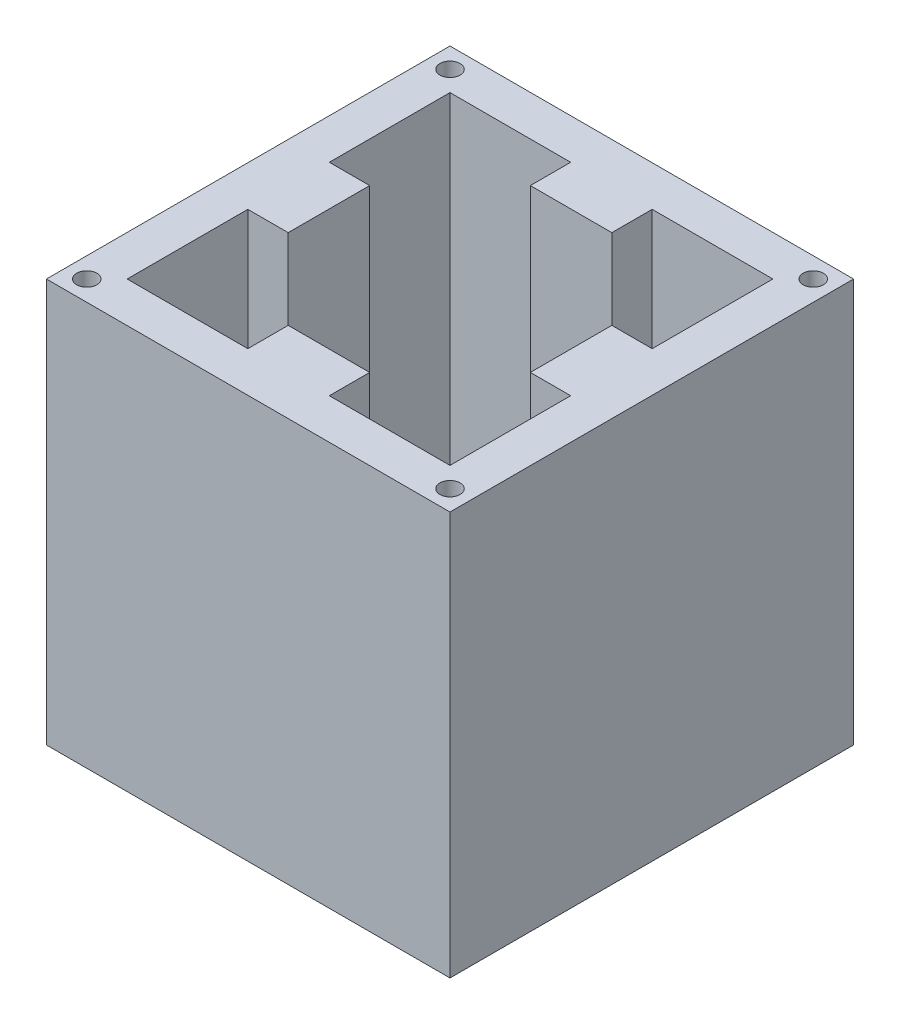
ISO-10303-21;
HEADER;
FILE_DESCRIPTION(('STEP AP214'),'2;1');
FILE_NAME('part.step','',(''),(''),'','','');
FILE_SCHEMA(('AUTOMOTIVE_DESIGN { 1 0 10303 214 1 1 1 1 }'));
ENDSEC;
DATA;
#1=APPLICATION_CONTEXT('core data for automotive mechanical design processes');
#2=APPLICATION_PROTOCOL_DEFINITION('international standard','automotive_design',2000,#1);
#3=PRODUCT_CONTEXT('',#1,'mechanical');
#4=PRODUCT('Part','Part','',(#3));
#5=PRODUCT_RELATED_PRODUCT_CATEGORY('part','',(#4));
#6=PRODUCT_DEFINITION_FORMATION('','',#4);
#7=PRODUCT_DEFINITION_CONTEXT('part definition',#1,'design');
#8=PRODUCT_DEFINITION('design','',#6,#7);
#9=PRODUCT_DEFINITION_SHAPE('','',#8);
#10=(LENGTH_UNIT() NAMED_UNIT(*) SI_UNIT(.MILLI.,.METRE.));
#11=(NAMED_UNIT(*) PLANE_ANGLE_UNIT() SI_UNIT($,.RADIAN.));
#12=(NAMED_UNIT(*) SI_UNIT($,.STERADIAN.) SOLID_ANGLE_UNIT());
#13=UNCERTAINTY_MEASURE_WITH_UNIT(LENGTH_MEASURE(1.E-05),#10,'distance_accuracy_value','');
#14=(GEOMETRIC_REPRESENTATION_CONTEXT(3) GLOBAL_UNCERTAINTY_ASSIGNED_CONTEXT((#13)) GLOBAL_UNIT_ASSIGNED_CONTEXT((#10,
#11,#12)) REPRESENTATION_CONTEXT('',''));
#15=CARTESIAN_POINT('',(0.,0.,0.));
#16=DIRECTION('',(0.,0.,1.));
#17=DIRECTION('',(1.,0.,0.));
#18=AXIS2_PLACEMENT_3D('',#15,#16,#17);
#19=CARTESIAN_POINT('',(-12.7,25.4,-12.7));
#20=DIRECTION('',(0.,0.,-1.));
#21=DIRECTION('',(-1.,0.,0.));
#22=AXIS2_PLACEMENT_3D('',#19,#20,#21);
#23=PLANE('',#22);
#24=DIRECTION('',(1.,0.,0.));
#25=VECTOR('',#24,1.);
#26=CARTESIAN_POINT('',(-12.7,0.,-12.7));
#27=LINE('',#26,#25);
#28=CARTESIAN_POINT('',(-12.7,0.,-12.7));
#29=VERTEX_POINT('',#28);
#30=CARTESIAN_POINT('',(12.7,0.,-12.7));
#31=VERTEX_POINT('',#30);
#32=EDGE_CURVE('E346',#29,#31,#27,.T.);
#33=ORIENTED_EDGE('',*,*,#32,.F.);
#34=DIRECTION('',(0.,-1.,0.));
#35=VECTOR('',#34,1.);
#36=CARTESIAN_POINT('',(-12.7,25.4,-12.7));
#37=LINE('',#36,#35);
#38=CARTESIAN_POINT('',(-12.7,25.4,-12.7));
#39=VERTEX_POINT('',#38);
#40=EDGE_CURVE('E66',#39,#29,#37,.T.);
#41=ORIENTED_EDGE('',*,*,#40,.F.);
#42=DIRECTION('',(1.,0.,0.));
#43=VECTOR('',#42,1.);
#44=CARTESIAN_POINT('',(-12.7,25.4,-12.7));
#45=LINE('',#44,#43);
#46=CARTESIAN_POINT('',(12.7,25.4,-12.7));
#47=VERTEX_POINT('',#46);
#48=EDGE_CURVE('E382',#39,#47,#45,.T.);
#49=ORIENTED_EDGE('',*,*,#48,.T.);
#50=DIRECTION('',(0.,-1.,0.));
#51=VECTOR('',#50,1.);
#52=CARTESIAN_POINT('',(12.7,25.4,-12.7));
#53=LINE('',#52,#51);
#54=EDGE_CURVE('E390',#47,#31,#53,.T.);
#55=ORIENTED_EDGE('',*,*,#54,.T.);
#56=EDGE_LOOP('',(#33,#41,#49,#55));
#57=FACE_BOUND('',#56,.T.);
#58=ADVANCED_FACE('F41',(#57),#23,.T.);
#59=CARTESIAN_POINT('',(-12.7,25.4,12.7));
#60=DIRECTION('',(-1.,0.,0.));
#61=DIRECTION('',(0.,0.,1.));
#62=AXIS2_PLACEMENT_3D('',#59,#60,#61);
#63=PLANE('',#62);
#64=DIRECTION('',(0.,0.,-1.));
#65=VECTOR('',#64,1.);
#66=CARTESIAN_POINT('',(-12.7,0.,12.7));
#67=LINE('',#66,#65);
#68=CARTESIAN_POINT('',(-12.7,0.,12.7));
#69=VERTEX_POINT('',#68);
#70=EDGE_CURVE('E384',#69,#29,#67,.T.);
#71=ORIENTED_EDGE('',*,*,#70,.F.);
#72=DIRECTION('',(0.,-1.,0.));
#73=VECTOR('',#72,1.);
#74=CARTESIAN_POINT('',(-12.7,25.4,12.7));
#75=LINE('',#74,#73);
#76=CARTESIAN_POINT('',(-12.7,25.4,12.7));
#77=VERTEX_POINT('',#76);
#78=EDGE_CURVE('E401',#77,#69,#75,.T.);
#79=ORIENTED_EDGE('',*,*,#78,.F.);
#80=DIRECTION('',(0.,0.,-1.));
#81=VECTOR('',#80,1.);
#82=CARTESIAN_POINT('',(-12.7,25.4,12.7));
#83=LINE('',#82,#81);
#84=EDGE_CURVE('E388',#77,#39,#83,.T.);
#85=ORIENTED_EDGE('',*,*,#84,.T.);
#86=ORIENTED_EDGE('',*,*,#40,.T.);
#87=EDGE_LOOP('',(#71,#79,#85,#86));
#88=FACE_BOUND('',#87,.T.);
#89=ADVANCED_FACE('F420',(#88),#63,.T.);
#90=CARTESIAN_POINT('',(-12.7,25.4,12.7));
#91=DIRECTION('',(0.,0.,-1.));
#92=DIRECTION('',(-1.,0.,0.));
#93=AXIS2_PLACEMENT_3D('',#90,#91,#92);
#94=PLANE('',#93);
#95=DIRECTION('',(1.,0.,0.));
#96=VECTOR('',#95,1.);
#97=CARTESIAN_POINT('',(-12.7,0.,12.7));
#98=LINE('',#97,#96);
#99=CARTESIAN_POINT('',(12.7,0.,12.7));
#100=VERTEX_POINT('',#99);
#101=EDGE_CURVE('E396',#69,#100,#98,.T.);
#102=ORIENTED_EDGE('',*,*,#101,.T.);
#103=DIRECTION('',(0.,-1.,0.));
#104=VECTOR('',#103,1.);
#105=CARTESIAN_POINT('',(12.7,25.4,12.7));
#106=LINE('',#105,#104);
#107=CARTESIAN_POINT('',(12.7,25.4,12.7));
#108=VERTEX_POINT('',#107);
#109=EDGE_CURVE('E403',#108,#100,#106,.T.);
#110=ORIENTED_EDGE('',*,*,#109,.F.);
#111=DIRECTION('',(1.,0.,0.));
#112=VECTOR('',#111,1.);
#113=CARTESIAN_POINT('',(-12.7,25.4,12.7));
#114=LINE('',#113,#112);
#115=EDGE_CURVE('E386',#77,#108,#114,.T.);
#116=ORIENTED_EDGE('',*,*,#115,.F.);
#117=ORIENTED_EDGE('',*,*,#78,.T.);
#118=EDGE_LOOP('',(#102,#110,#116,#117));
#119=FACE_BOUND('',#118,.T.);
#120=ADVANCED_FACE('F424',(#119),#94,.F.);
#121=CARTESIAN_POINT('',(12.7,25.4,12.7));
#122=DIRECTION('',(-1.,0.,0.));
#123=DIRECTION('',(0.,0.,1.));
#124=AXIS2_PLACEMENT_3D('',#121,#122,#123);
#125=PLANE('',#124);
#126=DIRECTION('',(0.,0.,-1.));
#127=VECTOR('',#126,1.);
#128=CARTESIAN_POINT('',(12.7,0.,12.7));
#129=LINE('',#128,#127);
#130=EDGE_CURVE('E393',#100,#31,#129,.T.);
#131=ORIENTED_EDGE('',*,*,#130,.T.);
#132=ORIENTED_EDGE('',*,*,#54,.F.);
#133=DIRECTION('',(0.,0.,-1.));
#134=VECTOR('',#133,1.);
#135=CARTESIAN_POINT('',(12.7,25.4,12.7));
#136=LINE('',#135,#134);
#137=EDGE_CURVE('E92',#108,#47,#136,.T.);
#138=ORIENTED_EDGE('',*,*,#137,.F.);
#139=ORIENTED_EDGE('',*,*,#109,.T.);
#140=EDGE_LOOP('',(#131,#132,#138,#139));
#141=FACE_BOUND('',#140,.T.);
#142=ADVANCED_FACE('F427',(#141),#125,.F.);
#143=CARTESIAN_POINT('',(0.,25.4,0.));
#144=DIRECTION('',(0.,1.,0.));
#145=DIRECTION('',(0.,0.,1.));
#146=AXIS2_PLACEMENT_3D('',#143,#144,#145);
#147=PLANE('',#146);
#148=CARTESIAN_POINT('',(11.43,25.4,-11.43));
#149=DIRECTION('',(0.,1.,0.));
#150=DIRECTION('',(0.,0.,1.));
#151=AXIS2_PLACEMENT_3D('',#148,#149,#150);
#152=CIRCLE('',#151,0.635000000000001);
#153=CARTESIAN_POINT('',(11.43,25.4,-10.795));
#154=VERTEX_POINT('',#153);
#155=EDGE_CURVE('E564',#154,#154,#152,.T.);
#156=ORIENTED_EDGE('',*,*,#155,.F.);
#157=EDGE_LOOP('',(#156));
#158=FACE_BOUND('',#157,.T.);
#159=CARTESIAN_POINT('',(-11.43,25.4,11.43));
#160=DIRECTION('',(0.,1.,0.));
#161=DIRECTION('',(0.,0.,1.));
#162=AXIS2_PLACEMENT_3D('',#159,#160,#161);
#163=CIRCLE('',#162,0.635000000000001);
#164=CARTESIAN_POINT('',(-11.43,25.4,12.065));
#165=VERTEX_POINT('',#164);
#166=EDGE_CURVE('E573',#165,#165,#163,.T.);
#167=ORIENTED_EDGE('',*,*,#166,.F.);
#168=EDGE_LOOP('',(#167));
#169=FACE_BOUND('',#168,.T.);
#170=CARTESIAN_POINT('',(-11.43,25.4,-11.43));
#171=DIRECTION('',(0.,1.,0.));
#172=DIRECTION('',(0.,0.,1.));
#173=AXIS2_PLACEMENT_3D('',#170,#171,#172);
#174=CIRCLE('',#173,0.635000000000001);
#175=CARTESIAN_POINT('',(-11.43,25.4,-10.795));
#176=VERTEX_POINT('',#175);
#177=EDGE_CURVE('E567',#176,#176,#174,.T.);
#178=ORIENTED_EDGE('',*,*,#177,.F.);
#179=EDGE_LOOP('',(#178));
#180=FACE_BOUND('',#179,.T.);
#181=CARTESIAN_POINT('',(11.43,25.4,11.43));
#182=DIRECTION('',(0.,1.,0.));
#183=DIRECTION('',(0.,0.,1.));
#184=AXIS2_PLACEMENT_3D('',#181,#182,#183);
#185=CIRCLE('',#184,0.635000000000001);
#186=CARTESIAN_POINT('',(11.43,25.4,12.065));
#187=VERTEX_POINT('',#186);
#188=EDGE_CURVE('E238',#187,#187,#185,.T.);
#189=ORIENTED_EDGE('',*,*,#188,.F.);
#190=EDGE_LOOP('',(#189));
#191=FACE_BOUND('',#190,.T.);
#192=DIRECTION('',(0.,0.,-1.));
#193=VECTOR('',#192,1.);
#194=CARTESIAN_POINT('',(10.16,25.4,-2.56512278395392));
#195=LINE('',#194,#193);
#196=CARTESIAN_POINT('',(10.16,25.4,-2.56512278395392));
#197=VERTEX_POINT('',#196);
#198=CARTESIAN_POINT('',(10.16,25.4,-10.16));
#199=VERTEX_POINT('',#198);
#200=EDGE_CURVE('E57',#197,#199,#195,.T.);
#201=ORIENTED_EDGE('',*,*,#200,.F.);
#202=DIRECTION('',(1.,0.,0.));
#203=VECTOR('',#202,1.);
#204=CARTESIAN_POINT('',(10.16,25.4,-2.56512278395392));
#205=LINE('',#204,#203);
#206=CARTESIAN_POINT('',(7.62,25.4,-2.56512278395392));
#207=VERTEX_POINT('',#206);
#208=EDGE_CURVE('E232',#207,#197,#205,.T.);
#209=ORIENTED_EDGE('',*,*,#208,.F.);
#210=DIRECTION('',(0.,0.,-1.));
#211=VECTOR('',#210,1.);
#212=CARTESIAN_POINT('',(7.62,25.4,-2.56512278395392));
#213=LINE('',#212,#211);
#214=CARTESIAN_POINT('',(7.62,25.4,2.56512278395392));
#215=VERTEX_POINT('',#214);
#216=EDGE_CURVE('E235',#215,#207,#213,.T.);
#217=ORIENTED_EDGE('',*,*,#216,.F.);
#218=DIRECTION('',(-1.,0.,0.));
#219=VECTOR('',#218,1.);
#220=CARTESIAN_POINT('',(7.62,25.4,2.56512278395392));
#221=LINE('',#220,#219);
#222=CARTESIAN_POINT('',(10.16,25.4,2.56512278395392));
#223=VERTEX_POINT('',#222);
#224=EDGE_CURVE('E339',#223,#215,#221,.T.);
#225=ORIENTED_EDGE('',*,*,#224,.F.);
#226=DIRECTION('',(0.,0.,-1.));
#227=VECTOR('',#226,1.);
#228=CARTESIAN_POINT('',(10.16,25.4,10.16));
#229=LINE('',#228,#227);
#230=CARTESIAN_POINT('',(10.16,25.4,10.16));
#231=VERTEX_POINT('',#230);
#232=EDGE_CURVE('E336',#231,#223,#229,.T.);
#233=ORIENTED_EDGE('',*,*,#232,.F.);
#234=DIRECTION('',(1.,0.,0.));
#235=VECTOR('',#234,1.);
#236=CARTESIAN_POINT('',(2.56512278395389,25.4,10.16));
#237=LINE('',#236,#235);
#238=CARTESIAN_POINT('',(2.56512278395389,25.4,10.16));
#239=VERTEX_POINT('',#238);
#240=EDGE_CURVE('E333',#239,#231,#237,.T.);
#241=ORIENTED_EDGE('',*,*,#240,.F.);
#242=DIRECTION('',(0.,0.,1.));
#243=VECTOR('',#242,1.);
#244=CARTESIAN_POINT('',(2.56512278395389,25.4,10.16));
#245=LINE('',#244,#243);
#246=CARTESIAN_POINT('',(2.56512278395389,25.4,7.62000000000001));
#247=VERTEX_POINT('',#246);
#248=EDGE_CURVE('E330',#247,#239,#245,.T.);
#249=ORIENTED_EDGE('',*,*,#248,.F.);
#250=DIRECTION('',(1.,0.,0.));
#251=VECTOR('',#250,1.);
#252=CARTESIAN_POINT('',(2.56512278395389,25.4,7.62000000000001));
#253=LINE('',#252,#251);
#254=CARTESIAN_POINT('',(-2.56512278395395,25.4,7.61999999999999));
#255=VERTEX_POINT('',#254);
#256=EDGE_CURVE('E327',#255,#247,#253,.T.);
#257=ORIENTED_EDGE('',*,*,#256,.F.);
#258=DIRECTION('',(0.,0.,-1.));
#259=VECTOR('',#258,1.);
#260=CARTESIAN_POINT('',(-2.56512278395395,25.4,7.61999999999999));
#261=LINE('',#260,#259);
#262=CARTESIAN_POINT('',(-2.56512278395396,25.4,10.16));
#263=VERTEX_POINT('',#262);
#264=EDGE_CURVE('E324',#263,#255,#261,.T.);
#265=ORIENTED_EDGE('',*,*,#264,.F.);
#266=DIRECTION('',(1.,0.,0.));
#267=VECTOR('',#266,1.);
#268=CARTESIAN_POINT('',(-10.16,25.4,10.16));
#269=LINE('',#268,#267);
#270=CARTESIAN_POINT('',(-10.16,25.4,10.16));
#271=VERTEX_POINT('',#270);
#272=EDGE_CURVE('E321',#271,#263,#269,.T.);
#273=ORIENTED_EDGE('',*,*,#272,.F.);
#274=DIRECTION('',(0.,0.,1.));
#275=VECTOR('',#274,1.);
#276=CARTESIAN_POINT('',(-10.16,25.4,2.56512278395385));
#277=LINE('',#276,#275);
#278=CARTESIAN_POINT('',(-10.16,25.4,2.56512278395385));
#279=VERTEX_POINT('',#278);
#280=EDGE_CURVE('E318',#279,#271,#277,.T.);
#281=ORIENTED_EDGE('',*,*,#280,.F.);
#282=DIRECTION('',(-1.,0.,0.));
#283=VECTOR('',#282,1.);
#284=CARTESIAN_POINT('',(-10.16,25.4,2.56512278395385));
#285=LINE('',#284,#283);
#286=CARTESIAN_POINT('',(-7.62000000000001,25.4,2.56512278395387));
#287=VERTEX_POINT('',#286);
#288=EDGE_CURVE('E315',#287,#279,#285,.T.);
#289=ORIENTED_EDGE('',*,*,#288,.F.);
#290=DIRECTION('',(0.,0.,1.));
#291=VECTOR('',#290,1.);
#292=CARTESIAN_POINT('',(-7.62000000000001,25.4,2.56512278395387));
#293=LINE('',#292,#291);
#294=CARTESIAN_POINT('',(-7.61999999999998,25.4,-2.56512278395397));
#295=VERTEX_POINT('',#294);
#296=EDGE_CURVE('E312',#295,#287,#293,.T.);
#297=ORIENTED_EDGE('',*,*,#296,.F.);
#298=DIRECTION('',(1.,0.,0.));
#299=VECTOR('',#298,1.);
#300=CARTESIAN_POINT('',(-7.61999999999998,25.4,-2.56512278395397));
#301=LINE('',#300,#299);
#302=CARTESIAN_POINT('',(-10.16,25.4,-2.56512278395399));
#303=VERTEX_POINT('',#302);
#304=EDGE_CURVE('E309',#303,#295,#301,.T.);
#305=ORIENTED_EDGE('',*,*,#304,.F.);
#306=DIRECTION('',(0.,0.,1.));
#307=VECTOR('',#306,1.);
#308=CARTESIAN_POINT('',(-10.16,25.4,-10.16));
#309=LINE('',#308,#307);
#310=CARTESIAN_POINT('',(-10.16,25.4,-10.16));
#311=VERTEX_POINT('',#310);
#312=EDGE_CURVE('E306',#311,#303,#309,.T.);
#313=ORIENTED_EDGE('',*,*,#312,.F.);
#314=DIRECTION('',(-1.,0.,0.));
#315=VECTOR('',#314,1.);
#316=CARTESIAN_POINT('',(-2.56512278395382,25.4,-10.16));
#317=LINE('',#316,#315);
#318=CARTESIAN_POINT('',(-2.56512278395382,25.4,-10.16));
#319=VERTEX_POINT('',#318);
#320=EDGE_CURVE('E303',#319,#311,#317,.T.);
#321=ORIENTED_EDGE('',*,*,#320,.F.);
#322=DIRECTION('',(0.,0.,-1.));
#323=VECTOR('',#322,1.);
#324=CARTESIAN_POINT('',(-2.56512278395382,25.4,-10.16));
#325=LINE('',#324,#323);
#326=CARTESIAN_POINT('',(-2.56512278395384,25.4,-7.62000000000002));
#327=VERTEX_POINT('',#326);
#328=EDGE_CURVE('E300',#327,#319,#325,.T.);
#329=ORIENTED_EDGE('',*,*,#328,.F.);
#330=DIRECTION('',(-1.,0.,0.));
#331=VECTOR('',#330,1.);
#332=CARTESIAN_POINT('',(-2.56512278395384,25.4,-7.62000000000002));
#333=LINE('',#332,#331);
#334=CARTESIAN_POINT('',(2.565122783954,25.4,-7.61999999999997));
#335=VERTEX_POINT('',#334);
#336=EDGE_CURVE('E297',#335,#327,#333,.T.);
#337=ORIENTED_EDGE('',*,*,#336,.F.);
#338=DIRECTION('',(0.,0.,1.));
#339=VECTOR('',#338,1.);
#340=CARTESIAN_POINT('',(2.565122783954,25.4,-7.61999999999997));
#341=LINE('',#340,#339);
#342=CARTESIAN_POINT('',(2.56512278395403,25.4,-10.16));
#343=VERTEX_POINT('',#342);
#344=EDGE_CURVE('E294',#343,#335,#341,.T.);
#345=ORIENTED_EDGE('',*,*,#344,.F.);
#346=DIRECTION('',(-1.,0.,0.));
#347=VECTOR('',#346,1.);
#348=CARTESIAN_POINT('',(10.16,25.4,-10.16));
#349=LINE('',#348,#347);
#350=EDGE_CURVE('E291',#199,#343,#349,.T.);
#351=ORIENTED_EDGE('',*,*,#350,.F.);
#352=EDGE_LOOP('',(#201,#209,#217,#225,#233,#241,#249,#257,#265,#273,#281,#289,#297,#305,#313,
#321,#329,#337,#345,#351));
#353=FACE_BOUND('',#352,.T.);
#354=ORIENTED_EDGE('',*,*,#48,.F.);
#355=ORIENTED_EDGE('',*,*,#84,.F.);
#356=ORIENTED_EDGE('',*,*,#115,.T.);
#357=ORIENTED_EDGE('',*,*,#137,.T.);
#358=EDGE_LOOP('',(#354,#355,#356,#357));
#359=FACE_BOUND('',#358,.T.);
#360=ADVANCED_FACE('F430',(#158,#169,#180,#191,#353,#359),#147,.T.);
#361=CARTESIAN_POINT('',(0.,0.,0.));
#362=DIRECTION('',(0.,1.,0.));
#363=DIRECTION('',(0.,0.,1.));
#364=AXIS2_PLACEMENT_3D('',#361,#362,#363);
#365=PLANE('',#364);
#366=ORIENTED_EDGE('',*,*,#32,.T.);
#367=ORIENTED_EDGE('',*,*,#130,.F.);
#368=ORIENTED_EDGE('',*,*,#101,.F.);
#369=ORIENTED_EDGE('',*,*,#70,.T.);
#370=EDGE_LOOP('',(#366,#367,#368,#369));
#371=FACE_BOUND('',#370,.T.);
#372=ADVANCED_FACE('F435',(#371),#365,.F.);
#373=CARTESIAN_POINT('',(10.16,2.54,-2.56512278395392));
#374=DIRECTION('',(1.,0.,0.));
#375=DIRECTION('',(0.,0.,-1.));
#376=AXIS2_PLACEMENT_3D('',#373,#374,#375);
#377=PLANE('',#376);
#378=ORIENTED_EDGE('',*,*,#200,.T.);
#379=DIRECTION('',(0.,1.,0.));
#380=VECTOR('',#379,1.);
#381=CARTESIAN_POINT('',(10.16,2.54,-10.16));
#382=LINE('',#381,#380);
#383=CARTESIAN_POINT('',(10.16,2.54,-10.16));
#384=VERTEX_POINT('',#383);
#385=EDGE_CURVE('E209',#384,#199,#382,.T.);
#386=ORIENTED_EDGE('',*,*,#385,.F.);
#387=DIRECTION('',(0.,0.,-1.));
#388=VECTOR('',#387,1.);
#389=CARTESIAN_POINT('',(10.16,2.54,-2.56512278395392));
#390=LINE('',#389,#388);
#391=CARTESIAN_POINT('',(10.16,2.54,-2.56512278395392));
#392=VERTEX_POINT('',#391);
#393=EDGE_CURVE('E213',#392,#384,#390,.T.);
#394=ORIENTED_EDGE('',*,*,#393,.F.);
#395=DIRECTION('',(0.,1.,0.));
#396=VECTOR('',#395,1.);
#397=CARTESIAN_POINT('',(10.16,2.54,-2.56512278395392));
#398=LINE('',#397,#396);
#399=EDGE_CURVE('E344',#392,#197,#398,.T.);
#400=ORIENTED_EDGE('',*,*,#399,.T.);
#401=EDGE_LOOP('',(#378,#386,#394,#400));
#402=FACE_BOUND('',#401,.T.);
#403=ADVANCED_FACE('F211',(#402),#377,.F.);
#404=CARTESIAN_POINT('',(10.16,2.54,-2.56512278395392));
#405=DIRECTION('',(0.,0.,1.));
#406=DIRECTION('',(1.,0.,0.));
#407=AXIS2_PLACEMENT_3D('',#404,#405,#406);
#408=PLANE('',#407);
#409=ORIENTED_EDGE('',*,*,#208,.T.);
#410=ORIENTED_EDGE('',*,*,#399,.F.);
#411=DIRECTION('',(1.,0.,0.));
#412=VECTOR('',#411,1.);
#413=CARTESIAN_POINT('',(10.16,2.54,-2.56512278395392));
#414=LINE('',#413,#412);
#415=CARTESIAN_POINT('',(7.62,2.54,-2.56512278395392));
#416=VERTEX_POINT('',#415);
#417=EDGE_CURVE('E219',#416,#392,#414,.T.);
#418=ORIENTED_EDGE('',*,*,#417,.F.);
#419=DIRECTION('',(0.,1.,0.));
#420=VECTOR('',#419,1.);
#421=CARTESIAN_POINT('',(7.62,2.54,-2.56512278395392));
#422=LINE('',#421,#420);
#423=EDGE_CURVE('E347',#416,#207,#422,.T.);
#424=ORIENTED_EDGE('',*,*,#423,.T.);
#425=EDGE_LOOP('',(#409,#410,#418,#424));
#426=FACE_BOUND('',#425,.T.);
#427=ADVANCED_FACE('F444',(#426),#408,.F.);
#428=CARTESIAN_POINT('',(7.62,2.54,-2.56512278395392));
#429=DIRECTION('',(1.,0.,0.));
#430=DIRECTION('',(0.,0.,-1.));
#431=AXIS2_PLACEMENT_3D('',#428,#429,#430);
#432=PLANE('',#431);
#433=ORIENTED_EDGE('',*,*,#216,.T.);
#434=ORIENTED_EDGE('',*,*,#423,.F.);
#435=DIRECTION('',(0.,0.,-1.));
#436=VECTOR('',#435,1.);
#437=CARTESIAN_POINT('',(7.62,2.54,-2.56512278395392));
#438=LINE('',#437,#436);
#439=CARTESIAN_POINT('',(7.62,2.54,2.56512278395392));
#440=VERTEX_POINT('',#439);
#441=EDGE_CURVE('E287',#440,#416,#438,.T.);
#442=ORIENTED_EDGE('',*,*,#441,.F.);
#443=DIRECTION('',(0.,1.,0.));
#444=VECTOR('',#443,1.);
#445=CARTESIAN_POINT('',(7.62,2.54,2.56512278395392));
#446=LINE('',#445,#444);
#447=EDGE_CURVE('E349',#440,#215,#446,.T.);
#448=ORIENTED_EDGE('',*,*,#447,.T.);
#449=EDGE_LOOP('',(#433,#434,#442,#448));
#450=FACE_BOUND('',#449,.T.);
#451=ADVANCED_FACE('F510',(#450),#432,.F.);
#452=CARTESIAN_POINT('',(7.62,2.54,2.56512278395392));
#453=DIRECTION('',(0.,0.,-1.));
#454=DIRECTION('',(-1.,0.,0.));
#455=AXIS2_PLACEMENT_3D('',#452,#453,#454);
#456=PLANE('',#455);
#457=ORIENTED_EDGE('',*,*,#224,.T.);
#458=ORIENTED_EDGE('',*,*,#447,.F.);
#459=DIRECTION('',(-1.,0.,0.));
#460=VECTOR('',#459,1.);
#461=CARTESIAN_POINT('',(7.62,2.54,2.56512278395392));
#462=LINE('',#461,#460);
#463=CARTESIAN_POINT('',(10.16,2.54,2.56512278395392));
#464=VERTEX_POINT('',#463);
#465=EDGE_CURVE('E284',#464,#440,#462,.T.);
#466=ORIENTED_EDGE('',*,*,#465,.F.);
#467=DIRECTION('',(0.,1.,0.));
#468=VECTOR('',#467,1.);
#469=CARTESIAN_POINT('',(10.16,2.54,2.56512278395392));
#470=LINE('',#469,#468);
#471=EDGE_CURVE('E351',#464,#223,#470,.T.);
#472=ORIENTED_EDGE('',*,*,#471,.T.);
#473=EDGE_LOOP('',(#457,#458,#466,#472));
#474=FACE_BOUND('',#473,.T.);
#475=ADVANCED_FACE('F506',(#474),#456,.F.);
#476=CARTESIAN_POINT('',(10.16,2.54,10.16));
#477=DIRECTION('',(1.,0.,0.));
#478=DIRECTION('',(0.,0.,-1.));
#479=AXIS2_PLACEMENT_3D('',#476,#477,#478);
#480=PLANE('',#479);
#481=ORIENTED_EDGE('',*,*,#232,.T.);
#482=ORIENTED_EDGE('',*,*,#471,.F.);
#483=DIRECTION('',(0.,0.,-1.));
#484=VECTOR('',#483,1.);
#485=CARTESIAN_POINT('',(10.16,2.54,10.16));
#486=LINE('',#485,#484);
#487=CARTESIAN_POINT('',(10.16,2.54,10.16));
#488=VERTEX_POINT('',#487);
#489=EDGE_CURVE('E281',#488,#464,#486,.T.);
#490=ORIENTED_EDGE('',*,*,#489,.F.);
#491=DIRECTION('',(0.,1.,0.));
#492=VECTOR('',#491,1.);
#493=CARTESIAN_POINT('',(10.16,2.54,10.16));
#494=LINE('',#493,#492);
#495=EDGE_CURVE('E353',#488,#231,#494,.T.);
#496=ORIENTED_EDGE('',*,*,#495,.T.);
#497=EDGE_LOOP('',(#481,#482,#490,#496));
#498=FACE_BOUND('',#497,.T.);
#499=ADVANCED_FACE('F502',(#498),#480,.F.);
#500=CARTESIAN_POINT('',(2.56512278395389,2.54,10.16));
#501=DIRECTION('',(0.,0.,1.));
#502=DIRECTION('',(1.,0.,0.));
#503=AXIS2_PLACEMENT_3D('',#500,#501,#502);
#504=PLANE('',#503);
#505=ORIENTED_EDGE('',*,*,#240,.T.);
#506=ORIENTED_EDGE('',*,*,#495,.F.);
#507=DIRECTION('',(1.,0.,0.));
#508=VECTOR('',#507,1.);
#509=CARTESIAN_POINT('',(2.56512278395389,2.54,10.16));
#510=LINE('',#509,#508);
#511=CARTESIAN_POINT('',(2.56512278395389,2.54,10.16));
#512=VERTEX_POINT('',#511);
#513=EDGE_CURVE('E278',#512,#488,#510,.T.);
#514=ORIENTED_EDGE('',*,*,#513,.F.);
#515=DIRECTION('',(0.,1.,0.));
#516=VECTOR('',#515,1.);
#517=CARTESIAN_POINT('',(2.56512278395389,2.54,10.16));
#518=LINE('',#517,#516);
#519=EDGE_CURVE('E355',#512,#239,#518,.T.);
#520=ORIENTED_EDGE('',*,*,#519,.T.);
#521=EDGE_LOOP('',(#505,#506,#514,#520));
#522=FACE_BOUND('',#521,.T.);
#523=ADVANCED_FACE('F498',(#522),#504,.F.);
#524=CARTESIAN_POINT('',(2.56512278395389,2.54,10.16));
#525=DIRECTION('',(-1.,0.,0.));
#526=DIRECTION('',(0.,0.,1.));
#527=AXIS2_PLACEMENT_3D('',#524,#525,#526);
#528=PLANE('',#527);
#529=ORIENTED_EDGE('',*,*,#248,.T.);
#530=ORIENTED_EDGE('',*,*,#519,.F.);
#531=DIRECTION('',(0.,0.,1.));
#532=VECTOR('',#531,1.);
#533=CARTESIAN_POINT('',(2.56512278395389,2.54,10.16));
#534=LINE('',#533,#532);
#535=CARTESIAN_POINT('',(2.56512278395389,2.54,7.62000000000001));
#536=VERTEX_POINT('',#535);
#537=EDGE_CURVE('E275',#536,#512,#534,.T.);
#538=ORIENTED_EDGE('',*,*,#537,.F.);
#539=DIRECTION('',(0.,1.,0.));
#540=VECTOR('',#539,1.);
#541=CARTESIAN_POINT('',(2.56512278395389,2.54,7.62000000000001));
#542=LINE('',#541,#540);
#543=EDGE_CURVE('E357',#536,#247,#542,.T.);
#544=ORIENTED_EDGE('',*,*,#543,.T.);
#545=EDGE_LOOP('',(#529,#530,#538,#544));
#546=FACE_BOUND('',#545,.T.);
#547=ADVANCED_FACE('F494',(#546),#528,.F.);
#548=CARTESIAN_POINT('',(2.56512278395389,2.54,7.62000000000001));
#549=DIRECTION('',(0.,0.,1.));
#550=DIRECTION('',(1.,0.,0.));
#551=AXIS2_PLACEMENT_3D('',#548,#549,#550);
#552=PLANE('',#551);
#553=ORIENTED_EDGE('',*,*,#256,.T.);
#554=ORIENTED_EDGE('',*,*,#543,.F.);
#555=DIRECTION('',(1.,0.,0.));
#556=VECTOR('',#555,1.);
#557=CARTESIAN_POINT('',(2.56512278395389,2.54,7.62000000000001));
#558=LINE('',#557,#556);
#559=CARTESIAN_POINT('',(-2.56512278395395,2.54,7.61999999999999));
#560=VERTEX_POINT('',#559);
#561=EDGE_CURVE('E272',#560,#536,#558,.T.);
#562=ORIENTED_EDGE('',*,*,#561,.F.);
#563=DIRECTION('',(0.,1.,0.));
#564=VECTOR('',#563,1.);
#565=CARTESIAN_POINT('',(-2.56512278395395,2.54,7.61999999999999));
#566=LINE('',#565,#564);
#567=EDGE_CURVE('E359',#560,#255,#566,.T.);
#568=ORIENTED_EDGE('',*,*,#567,.T.);
#569=EDGE_LOOP('',(#553,#554,#562,#568));
#570=FACE_BOUND('',#569,.T.);
#571=ADVANCED_FACE('F490',(#570),#552,.F.);
#572=CARTESIAN_POINT('',(-2.56512278395395,2.54,7.61999999999999));
#573=DIRECTION('',(1.,0.,0.));
#574=DIRECTION('',(0.,0.,-1.));
#575=AXIS2_PLACEMENT_3D('',#572,#573,#574);
#576=PLANE('',#575);
#577=ORIENTED_EDGE('',*,*,#264,.T.);
#578=ORIENTED_EDGE('',*,*,#567,.F.);
#579=DIRECTION('',(0.,0.,-1.));
#580=VECTOR('',#579,1.);
#581=CARTESIAN_POINT('',(-2.56512278395395,2.54,7.61999999999999));
#582=LINE('',#581,#580);
#583=CARTESIAN_POINT('',(-2.56512278395396,2.54,10.16));
#584=VERTEX_POINT('',#583);
#585=EDGE_CURVE('E269',#584,#560,#582,.T.);
#586=ORIENTED_EDGE('',*,*,#585,.F.);
#587=DIRECTION('',(0.,1.,0.));
#588=VECTOR('',#587,1.);
#589=CARTESIAN_POINT('',(-2.56512278395396,2.54,10.16));
#590=LINE('',#589,#588);
#591=EDGE_CURVE('E361',#584,#263,#590,.T.);
#592=ORIENTED_EDGE('',*,*,#591,.T.);
#593=EDGE_LOOP('',(#577,#578,#586,#592));
#594=FACE_BOUND('',#593,.T.);
#595=ADVANCED_FACE('F486',(#594),#576,.F.);
#596=CARTESIAN_POINT('',(-10.16,2.54,10.16));
#597=DIRECTION('',(0.,0.,1.));
#598=DIRECTION('',(1.,0.,0.));
#599=AXIS2_PLACEMENT_3D('',#596,#597,#598);
#600=PLANE('',#599);
#601=ORIENTED_EDGE('',*,*,#272,.T.);
#602=ORIENTED_EDGE('',*,*,#591,.F.);
#603=DIRECTION('',(1.,0.,0.));
#604=VECTOR('',#603,1.);
#605=CARTESIAN_POINT('',(-10.16,2.54,10.16));
#606=LINE('',#605,#604);
#607=CARTESIAN_POINT('',(-10.16,2.54,10.16));
#608=VERTEX_POINT('',#607);
#609=EDGE_CURVE('E266',#608,#584,#606,.T.);
#610=ORIENTED_EDGE('',*,*,#609,.F.);
#611=DIRECTION('',(0.,1.,0.));
#612=VECTOR('',#611,1.);
#613=CARTESIAN_POINT('',(-10.16,2.54,10.16));
#614=LINE('',#613,#612);
#615=EDGE_CURVE('E363',#608,#271,#614,.T.);
#616=ORIENTED_EDGE('',*,*,#615,.T.);
#617=EDGE_LOOP('',(#601,#602,#610,#616));
#618=FACE_BOUND('',#617,.T.);
#619=ADVANCED_FACE('F482',(#618),#600,.F.);
#620=CARTESIAN_POINT('',(-10.16,2.54,2.56512278395385));
#621=DIRECTION('',(-1.,0.,0.));
#622=DIRECTION('',(0.,0.,1.));
#623=AXIS2_PLACEMENT_3D('',#620,#621,#622);
#624=PLANE('',#623);
#625=ORIENTED_EDGE('',*,*,#280,.T.);
#626=ORIENTED_EDGE('',*,*,#615,.F.);
#627=DIRECTION('',(0.,0.,1.));
#628=VECTOR('',#627,1.);
#629=CARTESIAN_POINT('',(-10.16,2.54,2.56512278395385));
#630=LINE('',#629,#628);
#631=CARTESIAN_POINT('',(-10.16,2.54,2.56512278395385));
#632=VERTEX_POINT('',#631);
#633=EDGE_CURVE('E263',#632,#608,#630,.T.);
#634=ORIENTED_EDGE('',*,*,#633,.F.);
#635=DIRECTION('',(0.,1.,0.));
#636=VECTOR('',#635,1.);
#637=CARTESIAN_POINT('',(-10.16,2.54,2.56512278395385));
#638=LINE('',#637,#636);
#639=EDGE_CURVE('E365',#632,#279,#638,.T.);
#640=ORIENTED_EDGE('',*,*,#639,.T.);
#641=EDGE_LOOP('',(#625,#626,#634,#640));
#642=FACE_BOUND('',#641,.T.);
#643=ADVANCED_FACE('F478',(#642),#624,.F.);
#644=CARTESIAN_POINT('',(-10.16,2.54,2.56512278395385));
#645=DIRECTION('',(0.,0.,-1.));
#646=DIRECTION('',(-1.,0.,0.));
#647=AXIS2_PLACEMENT_3D('',#644,#645,#646);
#648=PLANE('',#647);
#649=ORIENTED_EDGE('',*,*,#288,.T.);
#650=ORIENTED_EDGE('',*,*,#639,.F.);
#651=DIRECTION('',(-1.,0.,0.));
#652=VECTOR('',#651,1.);
#653=CARTESIAN_POINT('',(-10.16,2.54,2.56512278395385));
#654=LINE('',#653,#652);
#655=CARTESIAN_POINT('',(-7.62000000000001,2.54,2.56512278395387));
#656=VERTEX_POINT('',#655);
#657=EDGE_CURVE('E260',#656,#632,#654,.T.);
#658=ORIENTED_EDGE('',*,*,#657,.F.);
#659=DIRECTION('',(0.,1.,0.));
#660=VECTOR('',#659,1.);
#661=CARTESIAN_POINT('',(-7.62000000000001,2.54,2.56512278395387));
#662=LINE('',#661,#660);
#663=EDGE_CURVE('E367',#656,#287,#662,.T.);
#664=ORIENTED_EDGE('',*,*,#663,.T.);
#665=EDGE_LOOP('',(#649,#650,#658,#664));
#666=FACE_BOUND('',#665,.T.);
#667=ADVANCED_FACE('F474',(#666),#648,.F.);
#668=CARTESIAN_POINT('',(-7.62000000000001,2.54,2.56512278395387));
#669=DIRECTION('',(-1.,0.,0.));
#670=DIRECTION('',(0.,0.,1.));
#671=AXIS2_PLACEMENT_3D('',#668,#669,#670);
#672=PLANE('',#671);
#673=ORIENTED_EDGE('',*,*,#296,.T.);
#674=ORIENTED_EDGE('',*,*,#663,.F.);
#675=DIRECTION('',(0.,0.,1.));
#676=VECTOR('',#675,1.);
#677=CARTESIAN_POINT('',(-7.62000000000001,2.54,2.56512278395387));
#678=LINE('',#677,#676);
#679=CARTESIAN_POINT('',(-7.61999999999998,2.54,-2.56512278395397));
#680=VERTEX_POINT('',#679);
#681=EDGE_CURVE('E257',#680,#656,#678,.T.);
#682=ORIENTED_EDGE('',*,*,#681,.F.);
#683=DIRECTION('',(0.,1.,0.));
#684=VECTOR('',#683,1.);
#685=CARTESIAN_POINT('',(-7.61999999999998,2.54,-2.56512278395397));
#686=LINE('',#685,#684);
#687=EDGE_CURVE('E369',#680,#295,#686,.T.);
#688=ORIENTED_EDGE('',*,*,#687,.T.);
#689=EDGE_LOOP('',(#673,#674,#682,#688));
#690=FACE_BOUND('',#689,.T.);
#691=ADVANCED_FACE('F470',(#690),#672,.F.);
#692=CARTESIAN_POINT('',(-7.61999999999998,2.54,-2.56512278395397));
#693=DIRECTION('',(0.,0.,1.));
#694=DIRECTION('',(1.,0.,0.));
#695=AXIS2_PLACEMENT_3D('',#692,#693,#694);
#696=PLANE('',#695);
#697=ORIENTED_EDGE('',*,*,#304,.T.);
#698=ORIENTED_EDGE('',*,*,#687,.F.);
#699=DIRECTION('',(1.,0.,0.));
#700=VECTOR('',#699,1.);
#701=CARTESIAN_POINT('',(-7.61999999999998,2.54,-2.56512278395397));
#702=LINE('',#701,#700);
#703=CARTESIAN_POINT('',(-10.16,2.54,-2.56512278395399));
#704=VERTEX_POINT('',#703);
#705=EDGE_CURVE('E254',#704,#680,#702,.T.);
#706=ORIENTED_EDGE('',*,*,#705,.F.);
#707=DIRECTION('',(0.,1.,0.));
#708=VECTOR('',#707,1.);
#709=CARTESIAN_POINT('',(-10.16,2.54,-2.56512278395399));
#710=LINE('',#709,#708);
#711=EDGE_CURVE('E371',#704,#303,#710,.T.);
#712=ORIENTED_EDGE('',*,*,#711,.T.);
#713=EDGE_LOOP('',(#697,#698,#706,#712));
#714=FACE_BOUND('',#713,.T.);
#715=ADVANCED_FACE('F466',(#714),#696,.F.);
#716=CARTESIAN_POINT('',(-10.16,2.54,-10.16));
#717=DIRECTION('',(-1.,0.,0.));
#718=DIRECTION('',(0.,0.,1.));
#719=AXIS2_PLACEMENT_3D('',#716,#717,#718);
#720=PLANE('',#719);
#721=ORIENTED_EDGE('',*,*,#312,.T.);
#722=ORIENTED_EDGE('',*,*,#711,.F.);
#723=DIRECTION('',(0.,0.,1.));
#724=VECTOR('',#723,1.);
#725=CARTESIAN_POINT('',(-10.16,2.54,-10.16));
#726=LINE('',#725,#724);
#727=CARTESIAN_POINT('',(-10.16,2.54,-10.16));
#728=VERTEX_POINT('',#727);
#729=EDGE_CURVE('E251',#728,#704,#726,.T.);
#730=ORIENTED_EDGE('',*,*,#729,.F.);
#731=DIRECTION('',(0.,1.,0.));
#732=VECTOR('',#731,1.);
#733=CARTESIAN_POINT('',(-10.16,2.54,-10.16));
#734=LINE('',#733,#732);
#735=EDGE_CURVE('E373',#728,#311,#734,.T.);
#736=ORIENTED_EDGE('',*,*,#735,.T.);
#737=EDGE_LOOP('',(#721,#722,#730,#736));
#738=FACE_BOUND('',#737,.T.);
#739=ADVANCED_FACE('F462',(#738),#720,.F.);
#740=CARTESIAN_POINT('',(-2.56512278395382,2.54,-10.16));
#741=DIRECTION('',(0.,0.,-1.));
#742=DIRECTION('',(-1.,0.,0.));
#743=AXIS2_PLACEMENT_3D('',#740,#741,#742);
#744=PLANE('',#743);
#745=ORIENTED_EDGE('',*,*,#320,.T.);
#746=ORIENTED_EDGE('',*,*,#735,.F.);
#747=DIRECTION('',(-1.,0.,0.));
#748=VECTOR('',#747,1.);
#749=CARTESIAN_POINT('',(-2.56512278395382,2.54,-10.16));
#750=LINE('',#749,#748);
#751=CARTESIAN_POINT('',(-2.56512278395382,2.54,-10.16));
#752=VERTEX_POINT('',#751);
#753=EDGE_CURVE('E248',#752,#728,#750,.T.);
#754=ORIENTED_EDGE('',*,*,#753,.F.);
#755=DIRECTION('',(0.,1.,0.));
#756=VECTOR('',#755,1.);
#757=CARTESIAN_POINT('',(-2.56512278395382,2.54,-10.16));
#758=LINE('',#757,#756);
#759=EDGE_CURVE('E375',#752,#319,#758,.T.);
#760=ORIENTED_EDGE('',*,*,#759,.T.);
#761=EDGE_LOOP('',(#745,#746,#754,#760));
#762=FACE_BOUND('',#761,.T.);
#763=ADVANCED_FACE('F458',(#762),#744,.F.);
#764=CARTESIAN_POINT('',(-2.56512278395382,2.54,-10.16));
#765=DIRECTION('',(1.,0.,0.));
#766=DIRECTION('',(0.,0.,-1.));
#767=AXIS2_PLACEMENT_3D('',#764,#765,#766);
#768=PLANE('',#767);
#769=ORIENTED_EDGE('',*,*,#328,.T.);
#770=ORIENTED_EDGE('',*,*,#759,.F.);
#771=DIRECTION('',(0.,0.,-1.));
#772=VECTOR('',#771,1.);
#773=CARTESIAN_POINT('',(-2.56512278395382,2.54,-10.16));
#774=LINE('',#773,#772);
#775=CARTESIAN_POINT('',(-2.56512278395384,2.54,-7.62000000000002));
#776=VERTEX_POINT('',#775);
#777=EDGE_CURVE('E245',#776,#752,#774,.T.);
#778=ORIENTED_EDGE('',*,*,#777,.F.);
#779=DIRECTION('',(0.,1.,0.));
#780=VECTOR('',#779,1.);
#781=CARTESIAN_POINT('',(-2.56512278395384,2.54,-7.62000000000002));
#782=LINE('',#781,#780);
#783=EDGE_CURVE('E377',#776,#327,#782,.T.);
#784=ORIENTED_EDGE('',*,*,#783,.T.);
#785=EDGE_LOOP('',(#769,#770,#778,#784));
#786=FACE_BOUND('',#785,.T.);
#787=ADVANCED_FACE('F454',(#786),#768,.F.);
#788=CARTESIAN_POINT('',(-2.56512278395384,2.54,-7.62000000000002));
#789=DIRECTION('',(0.,0.,-1.));
#790=DIRECTION('',(-1.,0.,0.));
#791=AXIS2_PLACEMENT_3D('',#788,#789,#790);
#792=PLANE('',#791);
#793=ORIENTED_EDGE('',*,*,#336,.T.);
#794=ORIENTED_EDGE('',*,*,#783,.F.);
#795=DIRECTION('',(-1.,0.,0.));
#796=VECTOR('',#795,1.);
#797=CARTESIAN_POINT('',(-2.56512278395384,2.54,-7.62000000000002));
#798=LINE('',#797,#796);
#799=CARTESIAN_POINT('',(2.565122783954,2.54,-7.61999999999997));
#800=VERTEX_POINT('',#799);
#801=EDGE_CURVE('E242',#800,#776,#798,.T.);
#802=ORIENTED_EDGE('',*,*,#801,.F.);
#803=DIRECTION('',(0.,1.,0.));
#804=VECTOR('',#803,1.);
#805=CARTESIAN_POINT('',(2.565122783954,2.54,-7.61999999999997));
#806=LINE('',#805,#804);
#807=EDGE_CURVE('E379',#800,#335,#806,.T.);
#808=ORIENTED_EDGE('',*,*,#807,.T.);
#809=EDGE_LOOP('',(#793,#794,#802,#808));
#810=FACE_BOUND('',#809,.T.);
#811=ADVANCED_FACE('F450',(#810),#792,.F.);
#812=CARTESIAN_POINT('',(2.565122783954,2.54,-7.61999999999997));
#813=DIRECTION('',(-1.,0.,0.));
#814=DIRECTION('',(0.,0.,1.));
#815=AXIS2_PLACEMENT_3D('',#812,#813,#814);
#816=PLANE('',#815);
#817=ORIENTED_EDGE('',*,*,#344,.T.);
#818=ORIENTED_EDGE('',*,*,#807,.F.);
#819=DIRECTION('',(0.,0.,1.));
#820=VECTOR('',#819,1.);
#821=CARTESIAN_POINT('',(2.565122783954,2.54,-7.61999999999997));
#822=LINE('',#821,#820);
#823=CARTESIAN_POINT('',(2.56512278395403,2.54,-10.16));
#824=VERTEX_POINT('',#823);
#825=EDGE_CURVE('E227',#824,#800,#822,.T.);
#826=ORIENTED_EDGE('',*,*,#825,.F.);
#827=DIRECTION('',(0.,1.,0.));
#828=VECTOR('',#827,1.);
#829=CARTESIAN_POINT('',(2.56512278395403,2.54,-10.16));
#830=LINE('',#829,#828);
#831=EDGE_CURVE('E218',#824,#343,#830,.T.);
#832=ORIENTED_EDGE('',*,*,#831,.T.);
#833=EDGE_LOOP('',(#817,#818,#826,#832));
#834=FACE_BOUND('',#833,.T.);
#835=ADVANCED_FACE('F447',(#834),#816,.F.);
#836=CARTESIAN_POINT('',(10.16,2.54,-10.16));
#837=DIRECTION('',(0.,0.,-1.));
#838=DIRECTION('',(-1.,0.,0.));
#839=AXIS2_PLACEMENT_3D('',#836,#837,#838);
#840=PLANE('',#839);
#841=ORIENTED_EDGE('',*,*,#350,.T.);
#842=ORIENTED_EDGE('',*,*,#831,.F.);
#843=DIRECTION('',(-1.,0.,0.));
#844=VECTOR('',#843,1.);
#845=CARTESIAN_POINT('',(10.16,2.54,-10.16));
#846=LINE('',#845,#844);
#847=EDGE_CURVE('E222',#384,#824,#846,.T.);
#848=ORIENTED_EDGE('',*,*,#847,.F.);
#849=ORIENTED_EDGE('',*,*,#385,.T.);
#850=EDGE_LOOP('',(#841,#842,#848,#849));
#851=FACE_BOUND('',#850,.T.);
#852=ADVANCED_FACE('F223',(#851),#840,.F.);
#853=CARTESIAN_POINT('',(0.,2.54,0.));
#854=DIRECTION('',(0.,1.,0.));
#855=DIRECTION('',(0.,0.,1.));
#856=AXIS2_PLACEMENT_3D('',#853,#854,#855);
#857=PLANE('',#856);
#858=CARTESIAN_POINT('',(0.,2.54,0.));
#859=DIRECTION('',(0.,1.,0.));
#860=DIRECTION('',(0.,0.,1.));
#861=AXIS2_PLACEMENT_3D('',#858,#859,#860);
#862=CIRCLE('',#861,4.1275);
#863=CARTESIAN_POINT('',(0.,2.54,-4.1275));
#864=VERTEX_POINT('',#863);
#865=EDGE_CURVE('E560',#864,#864,#862,.T.);
#866=ORIENTED_EDGE('',*,*,#865,.F.);
#867=EDGE_LOOP('',(#866));
#868=FACE_BOUND('',#867,.T.);
#869=ORIENTED_EDGE('',*,*,#393,.T.);
#870=ORIENTED_EDGE('',*,*,#847,.T.);
#871=ORIENTED_EDGE('',*,*,#825,.T.);
#872=ORIENTED_EDGE('',*,*,#801,.T.);
#873=ORIENTED_EDGE('',*,*,#777,.T.);
#874=ORIENTED_EDGE('',*,*,#753,.T.);
#875=ORIENTED_EDGE('',*,*,#729,.T.);
#876=ORIENTED_EDGE('',*,*,#705,.T.);
#877=ORIENTED_EDGE('',*,*,#681,.T.);
#878=ORIENTED_EDGE('',*,*,#657,.T.);
#879=ORIENTED_EDGE('',*,*,#633,.T.);
#880=ORIENTED_EDGE('',*,*,#609,.T.);
#881=ORIENTED_EDGE('',*,*,#585,.T.);
#882=ORIENTED_EDGE('',*,*,#561,.T.);
#883=ORIENTED_EDGE('',*,*,#537,.T.);
#884=ORIENTED_EDGE('',*,*,#513,.T.);
#885=ORIENTED_EDGE('',*,*,#489,.T.);
#886=ORIENTED_EDGE('',*,*,#465,.T.);
#887=ORIENTED_EDGE('',*,*,#441,.T.);
#888=ORIENTED_EDGE('',*,*,#417,.T.);
#889=EDGE_LOOP('',(#869,#870,#871,#872,#873,#874,#875,#876,#877,#878,#879,#880,#881,#882,#883,
#884,#885,#886,#887,#888));
#890=FACE_BOUND('',#889,.T.);
#891=ADVANCED_FACE('F229',(#868,#890),#857,.T.);
#892=CARTESIAN_POINT('',(11.43,17.78,11.43));
#893=DIRECTION('',(0.,1.,0.));
#894=DIRECTION('',(0.,0.,1.));
#895=AXIS2_PLACEMENT_3D('',#892,#893,#894);
#896=CYLINDRICAL_SURFACE('',#895,0.635000000000001);
#897=CARTESIAN_POINT('',(11.43,17.78,11.43));
#898=DIRECTION('',(0.,1.,0.));
#899=DIRECTION('',(0.,0.,1.));
#900=AXIS2_PLACEMENT_3D('',#897,#898,#899);
#901=CIRCLE('',#900,0.635000000000001);
#902=CARTESIAN_POINT('',(11.43,17.78,12.065));
#903=VERTEX_POINT('',#902);
#904=EDGE_CURVE('E292',#903,#903,#901,.T.);
#905=ORIENTED_EDGE('',*,*,#904,.F.);
#906=EDGE_LOOP('',(#905));
#907=FACE_BOUND('',#906,.T.);
#908=ORIENTED_EDGE('',*,*,#188,.T.);
#909=EDGE_LOOP('',(#908));
#910=FACE_BOUND('',#909,.T.);
#911=ADVANCED_FACE('F520',(#907,#910),#896,.F.);
#912=CARTESIAN_POINT('',(11.43,17.78,11.43));
#913=DIRECTION('',(0.,1.,0.));
#914=DIRECTION('',(0.,0.,1.));
#915=AXIS2_PLACEMENT_3D('',#912,#913,#914);
#916=PLANE('',#915);
#917=ORIENTED_EDGE('',*,*,#904,.T.);
#918=EDGE_LOOP('',(#917));
#919=FACE_BOUND('',#918,.T.);
#920=ADVANCED_FACE('F524',(#919),#916,.T.);
#921=CARTESIAN_POINT('',(-11.43,17.78,-11.43));
#922=DIRECTION('',(0.,1.,0.));
#923=DIRECTION('',(0.,0.,1.));
#924=AXIS2_PLACEMENT_3D('',#921,#922,#923);
#925=CYLINDRICAL_SURFACE('',#924,0.635000000000001);
#926=CARTESIAN_POINT('',(-11.43,17.78,-11.43));
#927=DIRECTION('',(0.,1.,0.));
#928=DIRECTION('',(0.,0.,1.));
#929=AXIS2_PLACEMENT_3D('',#926,#927,#928);
#930=CIRCLE('',#929,0.635000000000001);
#931=CARTESIAN_POINT('',(-11.43,17.78,-10.795));
#932=VERTEX_POINT('',#931);
#933=EDGE_CURVE('E570',#932,#932,#930,.T.);
#934=ORIENTED_EDGE('',*,*,#933,.F.);
#935=EDGE_LOOP('',(#934));
#936=FACE_BOUND('',#935,.T.);
#937=ORIENTED_EDGE('',*,*,#177,.T.);
#938=EDGE_LOOP('',(#937));
#939=FACE_BOUND('',#938,.T.);
#940=ADVANCED_FACE('F528',(#936,#939),#925,.F.);
#941=CARTESIAN_POINT('',(-11.43,17.78,-11.43));
#942=DIRECTION('',(0.,1.,0.));
#943=DIRECTION('',(0.,0.,1.));
#944=AXIS2_PLACEMENT_3D('',#941,#942,#943);
#945=PLANE('',#944);
#946=ORIENTED_EDGE('',*,*,#933,.T.);
#947=EDGE_LOOP('',(#946));
#948=FACE_BOUND('',#947,.T.);
#949=ADVANCED_FACE('F545',(#948),#945,.T.);
#950=CARTESIAN_POINT('',(-11.43,17.78,11.43));
#951=DIRECTION('',(0.,1.,0.));
#952=DIRECTION('',(0.,0.,1.));
#953=AXIS2_PLACEMENT_3D('',#950,#951,#952);
#954=CYLINDRICAL_SURFACE('',#953,0.635000000000001);
#955=CARTESIAN_POINT('',(-11.43,17.78,11.43));
#956=DIRECTION('',(0.,1.,0.));
#957=DIRECTION('',(0.,0.,1.));
#958=AXIS2_PLACEMENT_3D('',#955,#956,#957);
#959=CIRCLE('',#958,0.635000000000001);
#960=CARTESIAN_POINT('',(-11.43,17.78,12.065));
#961=VERTEX_POINT('',#960);
#962=EDGE_CURVE('E576',#961,#961,#959,.T.);
#963=ORIENTED_EDGE('',*,*,#962,.F.);
#964=EDGE_LOOP('',(#963));
#965=FACE_BOUND('',#964,.T.);
#966=ORIENTED_EDGE('',*,*,#166,.T.);
#967=EDGE_LOOP('',(#966));
#968=FACE_BOUND('',#967,.T.);
#969=ADVANCED_FACE('F541',(#965,#968),#954,.F.);
#970=CARTESIAN_POINT('',(-11.43,17.78,11.43));
#971=DIRECTION('',(0.,1.,0.));
#972=DIRECTION('',(0.,0.,1.));
#973=AXIS2_PLACEMENT_3D('',#970,#971,#972);
#974=PLANE('',#973);
#975=ORIENTED_EDGE('',*,*,#962,.T.);
#976=EDGE_LOOP('',(#975));
#977=FACE_BOUND('',#976,.T.);
#978=ADVANCED_FACE('F537',(#977),#974,.T.);
#979=CARTESIAN_POINT('',(11.43,17.78,-11.43));
#980=DIRECTION('',(0.,1.,0.));
#981=DIRECTION('',(0.,0.,1.));
#982=AXIS2_PLACEMENT_3D('',#979,#980,#981);
#983=CYLINDRICAL_SURFACE('',#982,0.635000000000001);
#984=CARTESIAN_POINT('',(11.43,17.78,-11.43));
#985=DIRECTION('',(0.,1.,0.));
#986=DIRECTION('',(0.,0.,1.));
#987=AXIS2_PLACEMENT_3D('',#984,#985,#986);
#988=CIRCLE('',#987,0.635000000000001);
#989=CARTESIAN_POINT('',(11.43,17.78,-10.795));
#990=VERTEX_POINT('',#989);
#991=EDGE_CURVE('E561',#990,#990,#988,.T.);
#992=ORIENTED_EDGE('',*,*,#991,.F.);
#993=EDGE_LOOP('',(#992));
#994=FACE_BOUND('',#993,.T.);
#995=ORIENTED_EDGE('',*,*,#155,.T.);
#996=EDGE_LOOP('',(#995));
#997=FACE_BOUND('',#996,.T.);
#998=ADVANCED_FACE('F533',(#994,#997),#983,.F.);
#999=CARTESIAN_POINT('',(11.43,17.78,-11.43));
#1000=DIRECTION('',(0.,1.,0.));
#1001=DIRECTION('',(0.,0.,1.));
#1002=AXIS2_PLACEMENT_3D('',#999,#1000,#1001);
#1003=PLANE('',#1002);
#1004=ORIENTED_EDGE('',*,*,#991,.T.);
#1005=EDGE_LOOP('',(#1004));
#1006=FACE_BOUND('',#1005,.T.);
#1007=ADVANCED_FACE('F530',(#1006),#1003,.T.);
#1008=CARTESIAN_POINT('',(0.,10.16,0.));
#1009=DIRECTION('',(0.,-1.,0.));
#1010=DIRECTION('',(0.,0.,-1.));
#1011=AXIS2_PLACEMENT_3D('',#1008,#1009,#1010);
#1012=CYLINDRICAL_SURFACE('',#1011,4.1275);
#1013=CARTESIAN_POINT('',(0.,8.89000000000001,0.));
#1014=DIRECTION('',(0.,1.,0.));
#1015=DIRECTION('',(0.,0.,1.));
#1016=AXIS2_PLACEMENT_3D('',#1013,#1014,#1015);
#1017=CIRCLE('',#1016,4.1275);
#1018=CARTESIAN_POINT('',(0.,8.89000000000001,-4.1275));
#1019=VERTEX_POINT('',#1018);
#1020=EDGE_CURVE('E11',#1019,#1019,#1017,.F.);
#1021=CARTESIAN_POINT('',(0.,8.89000000000001,-4.1275));
#1022=CARTESIAN_POINT('',(0.,8.82385416666668,-4.1275));
#1023=CARTESIAN_POINT('',(0.,8.75770833333335,-4.1275));
#1024=CARTESIAN_POINT('',(0.,8.62541666666668,-4.1275));
#1025=CARTESIAN_POINT('',(0.,8.55927083333335,-4.1275));
#1026=CARTESIAN_POINT('',(0.,8.42697916666668,-4.1275));
#1027=CARTESIAN_POINT('',(0.,8.36083333333334,-4.1275));
#1028=CARTESIAN_POINT('',(0.,8.22854166666668,-4.1275));
#1029=CARTESIAN_POINT('',(0.,8.16239583333334,-4.1275));
#1030=CARTESIAN_POINT('',(0.,8.03010416666668,-4.1275));
#1031=CARTESIAN_POINT('',(0.,7.96395833333334,-4.1275));
#1032=CARTESIAN_POINT('',(0.,7.83166666666668,-4.1275));
#1033=CARTESIAN_POINT('',(0.,7.76552083333334,-4.1275));
#1034=CARTESIAN_POINT('',(0.,7.63322916666668,-4.1275));
#1035=CARTESIAN_POINT('',(0.,7.56708333333335,-4.1275));
#1036=CARTESIAN_POINT('',(0.,7.43479166666668,-4.1275));
#1037=CARTESIAN_POINT('',(0.,7.36864583333334,-4.1275));
#1038=CARTESIAN_POINT('',(0.,7.23635416666668,-4.1275));
#1039=CARTESIAN_POINT('',(0.,7.17020833333334,-4.1275));
#1040=CARTESIAN_POINT('',(0.,7.03791666666668,-4.1275));
#1041=CARTESIAN_POINT('',(0.,6.97177083333334,-4.1275));
#1042=CARTESIAN_POINT('',(0.,6.83947916666667,-4.1275));
#1043=CARTESIAN_POINT('',(0.,6.77333333333334,-4.1275));
#1044=CARTESIAN_POINT('',(0.,6.64104166666668,-4.1275));
#1045=CARTESIAN_POINT('',(0.,6.57489583333334,-4.1275));
#1046=CARTESIAN_POINT('',(0.,6.44260416666667,-4.1275));
#1047=CARTESIAN_POINT('',(0.,6.37645833333334,-4.1275));
#1048=CARTESIAN_POINT('',(0.,6.24416666666667,-4.1275));
#1049=CARTESIAN_POINT('',(0.,6.17802083333334,-4.1275));
#1050=CARTESIAN_POINT('',(0.,6.04572916666667,-4.1275));
#1051=CARTESIAN_POINT('',(0.,5.97958333333334,-4.1275));
#1052=CARTESIAN_POINT('',(0.,5.84729166666667,-4.1275));
#1053=CARTESIAN_POINT('',(0.,5.78114583333334,-4.1275));
#1054=CARTESIAN_POINT('',(0.,5.64885416666667,-4.1275));
#1055=CARTESIAN_POINT('',(0.,5.58270833333334,-4.1275));
#1056=CARTESIAN_POINT('',(0.,5.45041666666667,-4.1275));
#1057=CARTESIAN_POINT('',(0.,5.38427083333334,-4.1275));
#1058=CARTESIAN_POINT('',(0.,5.25197916666667,-4.1275));
#1059=CARTESIAN_POINT('',(0.,5.18583333333334,-4.1275));
#1060=CARTESIAN_POINT('',(0.,5.05354166666667,-4.1275));
#1061=CARTESIAN_POINT('',(0.,4.98739583333334,-4.1275));
#1062=CARTESIAN_POINT('',(0.,4.85510416666667,-4.1275));
#1063=CARTESIAN_POINT('',(0.,4.78895833333334,-4.1275));
#1064=CARTESIAN_POINT('',(0.,4.65666666666667,-4.1275));
#1065=CARTESIAN_POINT('',(0.,4.59052083333334,-4.1275));
#1066=CARTESIAN_POINT('',(0.,4.45822916666667,-4.1275));
#1067=CARTESIAN_POINT('',(0.,4.39208333333334,-4.1275));
#1068=CARTESIAN_POINT('',(0.,4.25979166666667,-4.1275));
#1069=CARTESIAN_POINT('',(0.,4.19364583333334,-4.1275));
#1070=CARTESIAN_POINT('',(0.,4.06135416666667,-4.1275));
#1071=CARTESIAN_POINT('',(0.,3.99520833333334,-4.1275));
#1072=CARTESIAN_POINT('',(0.,3.86291666666667,-4.1275));
#1073=CARTESIAN_POINT('',(0.,3.79677083333334,-4.1275));
#1074=CARTESIAN_POINT('',(0.,3.66447916666667,-4.1275));
#1075=CARTESIAN_POINT('',(0.,3.59833333333334,-4.1275));
#1076=CARTESIAN_POINT('',(0.,3.46604166666667,-4.1275));
#1077=CARTESIAN_POINT('',(0.,3.39989583333334,-4.1275));
#1078=CARTESIAN_POINT('',(0.,3.26760416666667,-4.1275));
#1079=CARTESIAN_POINT('',(0.,3.20145833333333,-4.1275));
#1080=CARTESIAN_POINT('',(0.,3.06916666666667,-4.1275));
#1081=CARTESIAN_POINT('',(0.,3.00302083333333,-4.1275));
#1082=CARTESIAN_POINT('',(0.,2.87072916666667,-4.1275));
#1083=CARTESIAN_POINT('',(0.,2.80458333333333,-4.1275));
#1084=CARTESIAN_POINT('',(0.,2.67229166666667,-4.1275));
#1085=CARTESIAN_POINT('',(0.,2.60614583333333,-4.1275));
#1086=CARTESIAN_POINT('',(0.,2.54,-4.1275));
#1087=B_SPLINE_CURVE_WITH_KNOTS('',3,(#1021,#1022,#1023,#1024,#1025,#1026,#1027,#1028,#1029,
#1030,#1031,#1032,#1033,#1034,#1035,#1036,#1037,#1038,#1039,#1040,#1041,#1042,#1043,#1044,#1045,
#1046,#1047,#1048,#1049,#1050,#1051,#1052,#1053,#1054,#1055,#1056,#1057,#1058,#1059,#1060,#1061,
#1062,#1063,#1064,#1065,#1066,#1067,#1068,#1069,#1070,#1071,#1072,#1073,#1074,#1075,#1076,#1077,
#1078,#1079,#1080,#1081,#1082,#1083,#1084,#1085,#1086),.UNSPECIFIED.,.F.,.F.,(4,2,2,2,2,2,2,2,2,
2,2,2,2,2,2,2,2,2,2,2,2,2,2,2,2,2,2,2,2,2,2,2,4),(0.,0.198437500000001,0.396875000000001,
0.595312500000002,0.793750000000003,0.992187500000003,1.190625,1.3890625,1.5875,1.7859375,
1.98437500000001,2.18281250000001,2.38125000000001,2.57968750000001,2.77812500000001,
2.97656250000001,3.17500000000001,3.37343750000001,3.57187500000001,3.77031250000001,
3.96875000000001,4.16718750000001,4.36562500000001,4.56406250000001,4.76250000000001,
4.96093750000001,5.15937500000001,5.35781250000001,5.55625000000001,5.75468750000001,
5.95312500000001,6.15156250000001,6.35000000000001),.UNSPECIFIED.);
#1088=EDGE_CURVE('BSEAM416',#1019,#864,#1087,.T.);
#1089=ORIENTED_EDGE('',*,*,#1020,.T.);
#1090=ORIENTED_EDGE('',*,*,#865,.T.);
#1091=ORIENTED_EDGE('',*,*,#1088,.T.);
#1092=ORIENTED_EDGE('',*,*,#1088,.F.);
#1093=EDGE_LOOP('',(#1089,#1091,#1090,#1092));
#1094=FACE_BOUND('',#1093,.T.);
#1095=ADVANCED_FACE('F416',(#1094),#1012,.T.);
#1096=CARTESIAN_POINT('',(0.,10.16,0.));
#1097=DIRECTION('',(0.,1.,0.));
#1098=DIRECTION('',(0.,0.,1.));
#1099=AXIS2_PLACEMENT_3D('',#1096,#1097,#1098);
#1100=PLANE('',#1099);
#1101=CARTESIAN_POINT('',(0.,10.16,0.));
#1102=DIRECTION('',(0.,1.,0.));
#1103=DIRECTION('',(0.,0.,1.));
#1104=AXIS2_PLACEMENT_3D('',#1101,#1102,#1103);
#1105=CIRCLE('',#1104,2.85750000000002);
#1106=CARTESIAN_POINT('',(0.,10.16,2.85750000000002));
#1107=VERTEX_POINT('',#1106);
#1108=EDGE_CURVE('E50',#1107,#1107,#1105,.T.);
#1109=ORIENTED_EDGE('',*,*,#1108,.T.);
#1110=EDGE_LOOP('',(#1109));
#1111=FACE_BOUND('',#1110,.T.);
#1112=ADVANCED_FACE('F409',(#1111),#1100,.T.);
#1113=CARTESIAN_POINT('',(0.,10.16,0.));
#1114=DIRECTION('',(0.,-1.,0.));
#1115=DIRECTION('',(0.,0.,-1.));
#1116=AXIS2_PLACEMENT_3D('',#1113,#1114,#1115);
#1117=CONICAL_SURFACE('',#1116,2.85750000000002,0.785398163397447);
#1118=ORIENTED_EDGE('',*,*,#1020,.F.);
#1119=EDGE_LOOP('',(#1118));
#1120=FACE_BOUND('',#1119,.T.);
#1121=ORIENTED_EDGE('',*,*,#1108,.F.);
#1122=EDGE_LOOP('',(#1121));
#1123=FACE_BOUND('',#1122,.T.);
#1124=ADVANCED_FACE('F44',(#1120,#1123),#1117,.T.);
#1125=CLOSED_SHELL('',(#58,#89,#120,#142,#360,#372,#403,#427,#451,#475,#499,#523,#547,#571,#595,
#619,#643,#667,#691,#715,#739,#763,#787,#811,#835,#852,#891,#911,#920,#940,#949,#969,#978,#998,
#1007,#1095,#1112,#1124));
#1126=MANIFOLD_SOLID_BREP('B2',#1125);
#1127=ADVANCED_BREP_SHAPE_REPRESENTATION('',(#18,#1126),#14);
#1128=SHAPE_DEFINITION_REPRESENTATION(#9,#1127);
ENDSEC;
END-ISO-10303-21;
